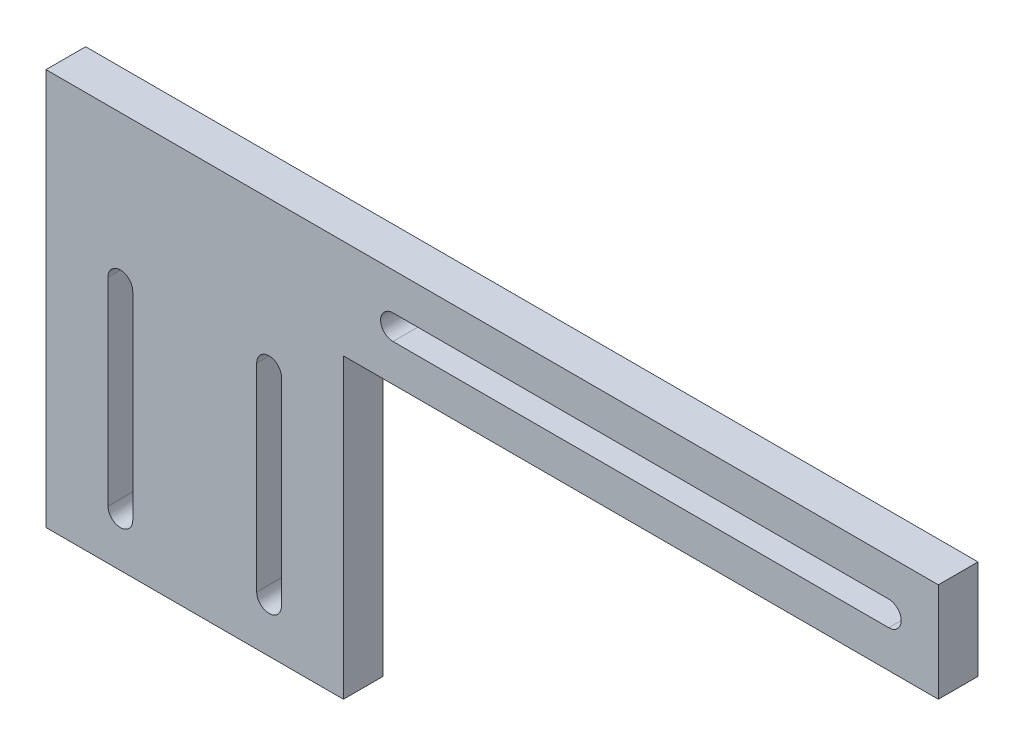
ISO-10303-21;
HEADER;
FILE_DESCRIPTION(('STEP AP214'),'2;1');
FILE_NAME('part.step','',(''),(''),'','','');
FILE_SCHEMA(('AUTOMOTIVE_DESIGN { 1 0 10303 214 1 1 1 1 }'));
ENDSEC;
DATA;
#1=APPLICATION_CONTEXT('core data for automotive mechanical design processes');
#2=APPLICATION_PROTOCOL_DEFINITION('international standard','automotive_design',2000,#1);
#3=PRODUCT_CONTEXT('',#1,'mechanical');
#4=PRODUCT('Part','Part','',(#3));
#5=PRODUCT_RELATED_PRODUCT_CATEGORY('part','',(#4));
#6=PRODUCT_DEFINITION_FORMATION('','',#4);
#7=PRODUCT_DEFINITION_CONTEXT('part definition',#1,'design');
#8=PRODUCT_DEFINITION('design','',#6,#7);
#9=PRODUCT_DEFINITION_SHAPE('','',#8);
#10=(LENGTH_UNIT() NAMED_UNIT(*) SI_UNIT(.MILLI.,.METRE.));
#11=(NAMED_UNIT(*) PLANE_ANGLE_UNIT() SI_UNIT($,.RADIAN.));
#12=(NAMED_UNIT(*) SI_UNIT($,.STERADIAN.) SOLID_ANGLE_UNIT());
#13=UNCERTAINTY_MEASURE_WITH_UNIT(LENGTH_MEASURE(1.E-05),#10,'distance_accuracy_value','');
#14=(GEOMETRIC_REPRESENTATION_CONTEXT(3) GLOBAL_UNCERTAINTY_ASSIGNED_CONTEXT((#13)) GLOBAL_UNIT_ASSIGNED_CONTEXT((#10,
#11,#12)) REPRESENTATION_CONTEXT('',''));
#15=CARTESIAN_POINT('',(0.,0.,0.));
#16=DIRECTION('',(0.,0.,1.));
#17=DIRECTION('',(1.,0.,0.));
#18=AXIS2_PLACEMENT_3D('',#15,#16,#17);
#19=CARTESIAN_POINT('',(0.,0.,5.08));
#20=DIRECTION('',(0.,0.,1.));
#21=DIRECTION('',(1.,0.,0.));
#22=AXIS2_PLACEMENT_3D('',#19,#20,#21);
#23=PLANE('',#22);
#24=DIRECTION('',(0.,-1.,0.));
#25=VECTOR('',#24,1.);
#26=CARTESIAN_POINT('',(0.,50.8,5.08));
#27=LINE('',#26,#25);
#28=CARTESIAN_POINT('',(0.,50.8,5.08));
#29=VERTEX_POINT('',#28);
#30=CARTESIAN_POINT('',(0.,0.,5.08));
#31=VERTEX_POINT('',#30);
#32=EDGE_CURVE('E258',#29,#31,#27,.T.);
#33=ORIENTED_EDGE('',*,*,#32,.T.);
#34=DIRECTION('',(1.,0.,0.));
#35=VECTOR('',#34,1.);
#36=CARTESIAN_POINT('',(0.,0.,5.08));
#37=LINE('',#36,#35);
#38=CARTESIAN_POINT('',(38.1,0.,5.08));
#39=VERTEX_POINT('',#38);
#40=EDGE_CURVE('E261',#31,#39,#37,.T.);
#41=ORIENTED_EDGE('',*,*,#40,.T.);
#42=DIRECTION('',(0.,1.,0.));
#43=VECTOR('',#42,1.);
#44=CARTESIAN_POINT('',(38.1,0.,5.08));
#45=LINE('',#44,#43);
#46=CARTESIAN_POINT('',(38.1,38.1,5.08));
#47=VERTEX_POINT('',#46);
#48=EDGE_CURVE('E264',#39,#47,#45,.T.);
#49=ORIENTED_EDGE('',*,*,#48,.T.);
#50=DIRECTION('',(1.,0.,0.));
#51=VECTOR('',#50,1.);
#52=CARTESIAN_POINT('',(38.1,38.1,5.08));
#53=LINE('',#52,#51);
#54=CARTESIAN_POINT('',(114.3,38.1,5.08));
#55=VERTEX_POINT('',#54);
#56=EDGE_CURVE('E266',#47,#55,#53,.T.);
#57=ORIENTED_EDGE('',*,*,#56,.T.);
#58=DIRECTION('',(0.,1.,0.));
#59=VECTOR('',#58,1.);
#60=CARTESIAN_POINT('',(114.3,38.1,5.08));
#61=LINE('',#60,#59);
#62=CARTESIAN_POINT('',(114.3,50.8,5.08));
#63=VERTEX_POINT('',#62);
#64=EDGE_CURVE('E268',#55,#63,#61,.T.);
#65=ORIENTED_EDGE('',*,*,#64,.T.);
#66=DIRECTION('',(-1.,0.,0.));
#67=VECTOR('',#66,1.);
#68=CARTESIAN_POINT('',(114.3,50.8,5.08));
#69=LINE('',#68,#67);
#70=EDGE_CURVE('E270',#63,#29,#69,.T.);
#71=ORIENTED_EDGE('',*,*,#70,.T.);
#72=EDGE_LOOP('',(#33,#41,#49,#57,#65,#71));
#73=FACE_BOUND('',#72,.T.);
#74=DIRECTION('',(0.,1.,0.));
#75=VECTOR('',#74,1.);
#76=CARTESIAN_POINT('',(11.1125,6.35,5.08));
#77=LINE('',#76,#75);
#78=CARTESIAN_POINT('',(11.1125,6.35,5.08));
#79=VERTEX_POINT('',#78);
#80=CARTESIAN_POINT('',(11.1125,31.75,5.08));
#81=VERTEX_POINT('',#80);
#82=EDGE_CURVE('E229',#79,#81,#77,.T.);
#83=ORIENTED_EDGE('',*,*,#82,.F.);
#84=CARTESIAN_POINT('',(9.525,6.35,5.08));
#85=DIRECTION('',(0.,0.,1.));
#86=DIRECTION('',(1.,0.,0.));
#87=AXIS2_PLACEMENT_3D('',#84,#85,#86);
#88=CIRCLE('',#87,1.5875);
#89=CARTESIAN_POINT('',(7.9375,6.35,5.08));
#90=VERTEX_POINT('',#89);
#91=EDGE_CURVE('E227',#90,#79,#88,.T.);
#92=ORIENTED_EDGE('',*,*,#91,.F.);
#93=DIRECTION('',(0.,-1.,0.));
#94=VECTOR('',#93,1.);
#95=CARTESIAN_POINT('',(7.9375,6.35,5.08));
#96=LINE('',#95,#94);
#97=CARTESIAN_POINT('',(7.9375,31.75,5.08));
#98=VERTEX_POINT('',#97);
#99=EDGE_CURVE('E235',#98,#90,#96,.T.);
#100=ORIENTED_EDGE('',*,*,#99,.F.);
#101=CARTESIAN_POINT('',(9.525,31.75,5.08));
#102=DIRECTION('',(0.,0.,1.));
#103=DIRECTION('',(1.,0.,0.));
#104=AXIS2_PLACEMENT_3D('',#101,#102,#103);
#105=CIRCLE('',#104,1.5875);
#106=EDGE_CURVE('E232',#81,#98,#105,.T.);
#107=ORIENTED_EDGE('',*,*,#106,.F.);
#108=EDGE_LOOP('',(#83,#92,#100,#107));
#109=FACE_BOUND('',#108,.T.);
#110=DIRECTION('',(0.,-1.,0.));
#111=VECTOR('',#110,1.);
#112=CARTESIAN_POINT('',(26.9875,31.75,5.08));
#113=LINE('',#112,#111);
#114=CARTESIAN_POINT('',(26.9875,31.75,5.08));
#115=VERTEX_POINT('',#114);
#116=CARTESIAN_POINT('',(26.9875,6.35,5.08));
#117=VERTEX_POINT('',#116);
#118=EDGE_CURVE('E198',#115,#117,#113,.T.);
#119=ORIENTED_EDGE('',*,*,#118,.F.);
#120=CARTESIAN_POINT('',(28.575,31.75,5.08));
#121=DIRECTION('',(0.,0.,1.));
#122=DIRECTION('',(1.,0.,0.));
#123=AXIS2_PLACEMENT_3D('',#120,#121,#122);
#124=CIRCLE('',#123,1.5875);
#125=CARTESIAN_POINT('',(30.1625,31.75,5.08));
#126=VERTEX_POINT('',#125);
#127=EDGE_CURVE('E196',#126,#115,#124,.T.);
#128=ORIENTED_EDGE('',*,*,#127,.F.);
#129=DIRECTION('',(0.,1.,0.));
#130=VECTOR('',#129,1.);
#131=CARTESIAN_POINT('',(30.1625,31.75,5.08));
#132=LINE('',#131,#130);
#133=CARTESIAN_POINT('',(30.1625,6.35,5.08));
#134=VERTEX_POINT('',#133);
#135=EDGE_CURVE('E204',#134,#126,#132,.T.);
#136=ORIENTED_EDGE('',*,*,#135,.F.);
#137=CARTESIAN_POINT('',(28.575,6.35,5.08));
#138=DIRECTION('',(0.,0.,1.));
#139=DIRECTION('',(1.,0.,0.));
#140=AXIS2_PLACEMENT_3D('',#137,#138,#139);
#141=CIRCLE('',#140,1.5875);
#142=EDGE_CURVE('E201',#117,#134,#141,.T.);
#143=ORIENTED_EDGE('',*,*,#142,.F.);
#144=EDGE_LOOP('',(#119,#128,#136,#143));
#145=FACE_BOUND('',#144,.T.);
#146=DIRECTION('',(-1.,0.,0.));
#147=VECTOR('',#146,1.);
#148=CARTESIAN_POINT('',(107.95,46.0375,5.08));
#149=LINE('',#148,#147);
#150=CARTESIAN_POINT('',(107.95,46.0375,5.08));
#151=VERTEX_POINT('',#150);
#152=CARTESIAN_POINT('',(44.45,46.0375,5.08));
#153=VERTEX_POINT('',#152);
#154=EDGE_CURVE('E168',#151,#153,#149,.T.);
#155=ORIENTED_EDGE('',*,*,#154,.F.);
#156=CARTESIAN_POINT('',(107.95,44.45,5.08));
#157=DIRECTION('',(0.,0.,1.));
#158=DIRECTION('',(1.,0.,0.));
#159=AXIS2_PLACEMENT_3D('',#156,#157,#158);
#160=CIRCLE('',#159,1.58750000000001);
#161=CARTESIAN_POINT('',(107.95,42.8625,5.08));
#162=VERTEX_POINT('',#161);
#163=EDGE_CURVE('E160',#162,#151,#160,.T.);
#164=ORIENTED_EDGE('',*,*,#163,.F.);
#165=DIRECTION('',(1.,0.,0.));
#166=VECTOR('',#165,1.);
#167=CARTESIAN_POINT('',(107.95,42.8625,5.08));
#168=LINE('',#167,#166);
#169=CARTESIAN_POINT('',(44.45,42.8625,5.08));
#170=VERTEX_POINT('',#169);
#171=EDGE_CURVE('E182',#170,#162,#168,.T.);
#172=ORIENTED_EDGE('',*,*,#171,.F.);
#173=CARTESIAN_POINT('',(44.45,44.45,5.08));
#174=DIRECTION('',(0.,0.,1.));
#175=DIRECTION('',(1.,0.,0.));
#176=AXIS2_PLACEMENT_3D('',#173,#174,#175);
#177=CIRCLE('',#176,1.58750000000001);
#178=EDGE_CURVE('E180',#153,#170,#177,.T.);
#179=ORIENTED_EDGE('',*,*,#178,.F.);
#180=EDGE_LOOP('',(#155,#164,#172,#179));
#181=FACE_BOUND('',#180,.T.);
#182=ADVANCED_FACE('F35',(#73,#109,#145,#181),#23,.T.);
#183=CARTESIAN_POINT('',(0.,0.,0.));
#184=DIRECTION('',(0.,0.,1.));
#185=DIRECTION('',(1.,0.,0.));
#186=AXIS2_PLACEMENT_3D('',#183,#184,#185);
#187=PLANE('',#186);
#188=CARTESIAN_POINT('',(28.575,31.75,0.));
#189=DIRECTION('',(0.,0.,1.));
#190=DIRECTION('',(1.,0.,0.));
#191=AXIS2_PLACEMENT_3D('',#188,#189,#190);
#192=CIRCLE('',#191,1.5875);
#193=CARTESIAN_POINT('',(30.1625,31.75,0.));
#194=VERTEX_POINT('',#193);
#195=CARTESIAN_POINT('',(26.9875,31.75,0.));
#196=VERTEX_POINT('',#195);
#197=EDGE_CURVE('E176',#194,#196,#192,.T.);
#198=ORIENTED_EDGE('',*,*,#197,.T.);
#199=DIRECTION('',(0.,-1.,0.));
#200=VECTOR('',#199,1.);
#201=CARTESIAN_POINT('',(26.9875,31.75,0.));
#202=LINE('',#201,#200);
#203=CARTESIAN_POINT('',(26.9875,6.35,0.));
#204=VERTEX_POINT('',#203);
#205=EDGE_CURVE('E209',#196,#204,#202,.T.);
#206=ORIENTED_EDGE('',*,*,#205,.T.);
#207=CARTESIAN_POINT('',(28.575,6.35,0.));
#208=DIRECTION('',(0.,0.,1.));
#209=DIRECTION('',(1.,0.,0.));
#210=AXIS2_PLACEMENT_3D('',#207,#208,#209);
#211=CIRCLE('',#210,1.5875);
#212=CARTESIAN_POINT('',(30.1625,6.35,0.));
#213=VERTEX_POINT('',#212);
#214=EDGE_CURVE('E212',#204,#213,#211,.T.);
#215=ORIENTED_EDGE('',*,*,#214,.T.);
#216=DIRECTION('',(0.,1.,0.));
#217=VECTOR('',#216,1.);
#218=CARTESIAN_POINT('',(30.1625,31.75,0.));
#219=LINE('',#218,#217);
#220=EDGE_CURVE('E199',#213,#194,#219,.T.);
#221=ORIENTED_EDGE('',*,*,#220,.T.);
#222=EDGE_LOOP('',(#198,#206,#215,#221));
#223=FACE_BOUND('',#222,.T.);
#224=DIRECTION('',(0.,-1.,0.));
#225=VECTOR('',#224,1.);
#226=CARTESIAN_POINT('',(0.,50.8,0.));
#227=LINE('',#226,#225);
#228=CARTESIAN_POINT('',(0.,50.8,0.));
#229=VERTEX_POINT('',#228);
#230=CARTESIAN_POINT('',(0.,0.,0.));
#231=VERTEX_POINT('',#230);
#232=EDGE_CURVE('E257',#229,#231,#227,.T.);
#233=ORIENTED_EDGE('',*,*,#232,.F.);
#234=DIRECTION('',(-1.,0.,0.));
#235=VECTOR('',#234,1.);
#236=CARTESIAN_POINT('',(114.3,50.8,0.));
#237=LINE('',#236,#235);
#238=CARTESIAN_POINT('',(114.3,50.8,0.));
#239=VERTEX_POINT('',#238);
#240=EDGE_CURVE('E262',#239,#229,#237,.T.);
#241=ORIENTED_EDGE('',*,*,#240,.F.);
#242=DIRECTION('',(0.,1.,0.));
#243=VECTOR('',#242,1.);
#244=CARTESIAN_POINT('',(114.3,38.1,0.));
#245=LINE('',#244,#243);
#246=CARTESIAN_POINT('',(114.3,38.1,0.));
#247=VERTEX_POINT('',#246);
#248=EDGE_CURVE('E281',#247,#239,#245,.T.);
#249=ORIENTED_EDGE('',*,*,#248,.F.);
#250=DIRECTION('',(1.,0.,0.));
#251=VECTOR('',#250,1.);
#252=CARTESIAN_POINT('',(38.1,38.1,0.));
#253=LINE('',#252,#251);
#254=CARTESIAN_POINT('',(38.1,38.1,0.));
#255=VERTEX_POINT('',#254);
#256=EDGE_CURVE('E279',#255,#247,#253,.T.);
#257=ORIENTED_EDGE('',*,*,#256,.F.);
#258=DIRECTION('',(0.,1.,0.));
#259=VECTOR('',#258,1.);
#260=CARTESIAN_POINT('',(38.1,0.,0.));
#261=LINE('',#260,#259);
#262=CARTESIAN_POINT('',(38.1,0.,0.));
#263=VERTEX_POINT('',#262);
#264=EDGE_CURVE('E277',#263,#255,#261,.T.);
#265=ORIENTED_EDGE('',*,*,#264,.F.);
#266=DIRECTION('',(1.,0.,0.));
#267=VECTOR('',#266,1.);
#268=CARTESIAN_POINT('',(0.,0.,0.));
#269=LINE('',#268,#267);
#270=EDGE_CURVE('E275',#231,#263,#269,.T.);
#271=ORIENTED_EDGE('',*,*,#270,.F.);
#272=EDGE_LOOP('',(#233,#241,#249,#257,#265,#271));
#273=FACE_BOUND('',#272,.T.);
#274=CARTESIAN_POINT('',(9.525,6.35,0.));
#275=DIRECTION('',(0.,0.,1.));
#276=DIRECTION('',(1.,0.,0.));
#277=AXIS2_PLACEMENT_3D('',#274,#275,#276);
#278=CIRCLE('',#277,1.5875);
#279=CARTESIAN_POINT('',(7.9375,6.35,0.));
#280=VERTEX_POINT('',#279);
#281=CARTESIAN_POINT('',(11.1125,6.35,0.));
#282=VERTEX_POINT('',#281);
#283=EDGE_CURVE('E226',#280,#282,#278,.T.);
#284=ORIENTED_EDGE('',*,*,#283,.T.);
#285=DIRECTION('',(0.,1.,0.));
#286=VECTOR('',#285,1.);
#287=CARTESIAN_POINT('',(11.1125,6.35,0.));
#288=LINE('',#287,#286);
#289=CARTESIAN_POINT('',(11.1125,31.75,0.));
#290=VERTEX_POINT('',#289);
#291=EDGE_CURVE('E240',#282,#290,#288,.T.);
#292=ORIENTED_EDGE('',*,*,#291,.T.);
#293=CARTESIAN_POINT('',(9.525,31.75,0.));
#294=DIRECTION('',(0.,0.,1.));
#295=DIRECTION('',(1.,0.,0.));
#296=AXIS2_PLACEMENT_3D('',#293,#294,#295);
#297=CIRCLE('',#296,1.5875);
#298=CARTESIAN_POINT('',(7.9375,31.75,0.));
#299=VERTEX_POINT('',#298);
#300=EDGE_CURVE('E243',#290,#299,#297,.T.);
#301=ORIENTED_EDGE('',*,*,#300,.T.);
#302=DIRECTION('',(0.,-1.,0.));
#303=VECTOR('',#302,1.);
#304=CARTESIAN_POINT('',(7.9375,6.35,0.));
#305=LINE('',#304,#303);
#306=EDGE_CURVE('E230',#299,#280,#305,.T.);
#307=ORIENTED_EDGE('',*,*,#306,.T.);
#308=EDGE_LOOP('',(#284,#292,#301,#307));
#309=FACE_BOUND('',#308,.T.);
#310=CARTESIAN_POINT('',(107.95,44.45,0.));
#311=DIRECTION('',(0.,0.,1.));
#312=DIRECTION('',(1.,0.,0.));
#313=AXIS2_PLACEMENT_3D('',#310,#311,#312);
#314=CIRCLE('',#313,1.58750000000001);
#315=CARTESIAN_POINT('',(107.95,42.8625,0.));
#316=VERTEX_POINT('',#315);
#317=CARTESIAN_POINT('',(107.95,46.0375,0.));
#318=VERTEX_POINT('',#317);
#319=EDGE_CURVE('E58',#316,#318,#314,.T.);
#320=ORIENTED_EDGE('',*,*,#319,.T.);
#321=DIRECTION('',(-1.,0.,0.));
#322=VECTOR('',#321,1.);
#323=CARTESIAN_POINT('',(107.95,46.0375,0.));
#324=LINE('',#323,#322);
#325=CARTESIAN_POINT('',(44.45,46.0375,0.));
#326=VERTEX_POINT('',#325);
#327=EDGE_CURVE('E175',#318,#326,#324,.T.);
#328=ORIENTED_EDGE('',*,*,#327,.T.);
#329=CARTESIAN_POINT('',(44.45,44.45,0.));
#330=DIRECTION('',(0.,0.,1.));
#331=DIRECTION('',(1.,0.,0.));
#332=AXIS2_PLACEMENT_3D('',#329,#330,#331);
#333=CIRCLE('',#332,1.58750000000001);
#334=CARTESIAN_POINT('',(44.45,42.8625,0.));
#335=VERTEX_POINT('',#334);
#336=EDGE_CURVE('E188',#326,#335,#333,.T.);
#337=ORIENTED_EDGE('',*,*,#336,.T.);
#338=DIRECTION('',(1.,0.,0.));
#339=VECTOR('',#338,1.);
#340=CARTESIAN_POINT('',(107.95,42.8625,0.));
#341=LINE('',#340,#339);
#342=EDGE_CURVE('E169',#335,#316,#341,.T.);
#343=ORIENTED_EDGE('',*,*,#342,.T.);
#344=EDGE_LOOP('',(#320,#328,#337,#343));
#345=FACE_BOUND('',#344,.T.);
#346=ADVANCED_FACE('F305',(#223,#273,#309,#345),#187,.F.);
#347=CARTESIAN_POINT('',(0.,50.8,5.08));
#348=DIRECTION('',(1.,0.,0.));
#349=DIRECTION('',(0.,1.,0.));
#350=AXIS2_PLACEMENT_3D('',#347,#348,#349);
#351=PLANE('',#350);
#352=ORIENTED_EDGE('',*,*,#232,.T.);
#353=DIRECTION('',(0.,0.,-1.));
#354=VECTOR('',#353,1.);
#355=CARTESIAN_POINT('',(0.,0.,5.08));
#356=LINE('',#355,#354);
#357=EDGE_CURVE('E11',#31,#231,#356,.T.);
#358=ORIENTED_EDGE('',*,*,#357,.F.);
#359=ORIENTED_EDGE('',*,*,#32,.F.);
#360=DIRECTION('',(0.,0.,-1.));
#361=VECTOR('',#360,1.);
#362=CARTESIAN_POINT('',(0.,50.8,5.08));
#363=LINE('',#362,#361);
#364=EDGE_CURVE('E272',#29,#229,#363,.T.);
#365=ORIENTED_EDGE('',*,*,#364,.T.);
#366=EDGE_LOOP('',(#352,#358,#359,#365));
#367=FACE_BOUND('',#366,.T.);
#368=ADVANCED_FACE('F37',(#367),#351,.F.);
#369=CARTESIAN_POINT('',(0.,0.,5.08));
#370=DIRECTION('',(0.,1.,0.));
#371=DIRECTION('',(0.,0.,1.));
#372=AXIS2_PLACEMENT_3D('',#369,#370,#371);
#373=PLANE('',#372);
#374=ORIENTED_EDGE('',*,*,#270,.T.);
#375=DIRECTION('',(0.,0.,-1.));
#376=VECTOR('',#375,1.);
#377=CARTESIAN_POINT('',(38.1,0.,5.08));
#378=LINE('',#377,#376);
#379=EDGE_CURVE('E43',#39,#263,#378,.T.);
#380=ORIENTED_EDGE('',*,*,#379,.F.);
#381=ORIENTED_EDGE('',*,*,#40,.F.);
#382=ORIENTED_EDGE('',*,*,#357,.T.);
#383=EDGE_LOOP('',(#374,#380,#381,#382));
#384=FACE_BOUND('',#383,.T.);
#385=ADVANCED_FACE('F323',(#384),#373,.F.);
#386=CARTESIAN_POINT('',(38.1,0.,5.08));
#387=DIRECTION('',(-1.,0.,0.));
#388=DIRECTION('',(0.,0.,1.));
#389=AXIS2_PLACEMENT_3D('',#386,#387,#388);
#390=PLANE('',#389);
#391=ORIENTED_EDGE('',*,*,#264,.T.);
#392=DIRECTION('',(0.,0.,-1.));
#393=VECTOR('',#392,1.);
#394=CARTESIAN_POINT('',(38.1,38.1,5.08));
#395=LINE('',#394,#393);
#396=EDGE_CURVE('E292',#47,#255,#395,.T.);
#397=ORIENTED_EDGE('',*,*,#396,.F.);
#398=ORIENTED_EDGE('',*,*,#48,.F.);
#399=ORIENTED_EDGE('',*,*,#379,.T.);
#400=EDGE_LOOP('',(#391,#397,#398,#399));
#401=FACE_BOUND('',#400,.T.);
#402=ADVANCED_FACE('F299',(#401),#390,.F.);
#403=CARTESIAN_POINT('',(38.1,38.1,5.08));
#404=DIRECTION('',(0.,1.,0.));
#405=DIRECTION('',(0.,0.,1.));
#406=AXIS2_PLACEMENT_3D('',#403,#404,#405);
#407=PLANE('',#406);
#408=ORIENTED_EDGE('',*,*,#256,.T.);
#409=DIRECTION('',(0.,0.,-1.));
#410=VECTOR('',#409,1.);
#411=CARTESIAN_POINT('',(114.3,38.1,5.08));
#412=LINE('',#411,#410);
#413=EDGE_CURVE('E289',#55,#247,#412,.T.);
#414=ORIENTED_EDGE('',*,*,#413,.F.);
#415=ORIENTED_EDGE('',*,*,#56,.F.);
#416=ORIENTED_EDGE('',*,*,#396,.T.);
#417=EDGE_LOOP('',(#408,#414,#415,#416));
#418=FACE_BOUND('',#417,.T.);
#419=ADVANCED_FACE('F311',(#418),#407,.F.);
#420=CARTESIAN_POINT('',(114.3,38.1,5.08));
#421=DIRECTION('',(-1.,0.,0.));
#422=DIRECTION('',(0.,-1.,0.));
#423=AXIS2_PLACEMENT_3D('',#420,#421,#422);
#424=PLANE('',#423);
#425=ORIENTED_EDGE('',*,*,#248,.T.);
#426=DIRECTION('',(0.,0.,-1.));
#427=VECTOR('',#426,1.);
#428=CARTESIAN_POINT('',(114.3,50.8,5.08));
#429=LINE('',#428,#427);
#430=EDGE_CURVE('E286',#63,#239,#429,.T.);
#431=ORIENTED_EDGE('',*,*,#430,.F.);
#432=ORIENTED_EDGE('',*,*,#64,.F.);
#433=ORIENTED_EDGE('',*,*,#413,.T.);
#434=EDGE_LOOP('',(#425,#431,#432,#433));
#435=FACE_BOUND('',#434,.T.);
#436=ADVANCED_FACE('F315',(#435),#424,.F.);
#437=CARTESIAN_POINT('',(114.3,50.8,5.08));
#438=DIRECTION('',(0.,-1.,0.));
#439=DIRECTION('',(1.,0.,0.));
#440=AXIS2_PLACEMENT_3D('',#437,#438,#439);
#441=PLANE('',#440);
#442=ORIENTED_EDGE('',*,*,#240,.T.);
#443=ORIENTED_EDGE('',*,*,#364,.F.);
#444=ORIENTED_EDGE('',*,*,#70,.F.);
#445=ORIENTED_EDGE('',*,*,#430,.T.);
#446=EDGE_LOOP('',(#442,#443,#444,#445));
#447=FACE_BOUND('',#446,.T.);
#448=ADVANCED_FACE('F326',(#447),#441,.F.);
#449=CARTESIAN_POINT('',(9.525,6.35,5.08));
#450=DIRECTION('',(0.,0.,-1.));
#451=DIRECTION('',(-1.,0.,0.));
#452=AXIS2_PLACEMENT_3D('',#449,#450,#451);
#453=CYLINDRICAL_SURFACE('',#452,1.5875);
#454=ORIENTED_EDGE('',*,*,#283,.F.);
#455=DIRECTION('',(0.,0.,-1.));
#456=VECTOR('',#455,1.);
#457=CARTESIAN_POINT('',(7.9375,6.35,5.08));
#458=LINE('',#457,#456);
#459=EDGE_CURVE('E237',#90,#280,#458,.T.);
#460=ORIENTED_EDGE('',*,*,#459,.F.);
#461=ORIENTED_EDGE('',*,*,#91,.T.);
#462=DIRECTION('',(0.,0.,-1.));
#463=VECTOR('',#462,1.);
#464=CARTESIAN_POINT('',(11.1125,6.35,5.08));
#465=LINE('',#464,#463);
#466=EDGE_CURVE('E254',#79,#282,#465,.T.);
#467=ORIENTED_EDGE('',*,*,#466,.T.);
#468=EDGE_LOOP('',(#454,#460,#461,#467));
#469=FACE_BOUND('',#468,.T.);
#470=ADVANCED_FACE('F328',(#469),#453,.F.);
#471=CARTESIAN_POINT('',(11.1125,6.35,5.08));
#472=DIRECTION('',(-1.,0.,0.));
#473=DIRECTION('',(0.,-1.,0.));
#474=AXIS2_PLACEMENT_3D('',#471,#472,#473);
#475=PLANE('',#474);
#476=ORIENTED_EDGE('',*,*,#291,.F.);
#477=ORIENTED_EDGE('',*,*,#466,.F.);
#478=ORIENTED_EDGE('',*,*,#82,.T.);
#479=DIRECTION('',(0.,0.,-1.));
#480=VECTOR('',#479,1.);
#481=CARTESIAN_POINT('',(11.1125,31.75,5.08));
#482=LINE('',#481,#480);
#483=EDGE_CURVE('E252',#81,#290,#482,.T.);
#484=ORIENTED_EDGE('',*,*,#483,.T.);
#485=EDGE_LOOP('',(#476,#477,#478,#484));
#486=FACE_BOUND('',#485,.T.);
#487=ADVANCED_FACE('F334',(#486),#475,.T.);
#488=CARTESIAN_POINT('',(9.525,31.75,5.08));
#489=DIRECTION('',(0.,0.,-1.));
#490=DIRECTION('',(-1.,0.,0.));
#491=AXIS2_PLACEMENT_3D('',#488,#489,#490);
#492=CYLINDRICAL_SURFACE('',#491,1.5875);
#493=ORIENTED_EDGE('',*,*,#300,.F.);
#494=ORIENTED_EDGE('',*,*,#483,.F.);
#495=ORIENTED_EDGE('',*,*,#106,.T.);
#496=DIRECTION('',(0.,0.,-1.));
#497=VECTOR('',#496,1.);
#498=CARTESIAN_POINT('',(7.9375,31.75,5.08));
#499=LINE('',#498,#497);
#500=EDGE_CURVE('E250',#98,#299,#499,.T.);
#501=ORIENTED_EDGE('',*,*,#500,.T.);
#502=EDGE_LOOP('',(#493,#494,#495,#501));
#503=FACE_BOUND('',#502,.T.);
#504=ADVANCED_FACE('F348',(#503),#492,.F.);
#505=CARTESIAN_POINT('',(7.9375,6.35,5.08));
#506=DIRECTION('',(1.,0.,0.));
#507=DIRECTION('',(0.,1.,0.));
#508=AXIS2_PLACEMENT_3D('',#505,#506,#507);
#509=PLANE('',#508);
#510=ORIENTED_EDGE('',*,*,#306,.F.);
#511=ORIENTED_EDGE('',*,*,#500,.F.);
#512=ORIENTED_EDGE('',*,*,#99,.T.);
#513=ORIENTED_EDGE('',*,*,#459,.T.);
#514=EDGE_LOOP('',(#510,#511,#512,#513));
#515=FACE_BOUND('',#514,.T.);
#516=ADVANCED_FACE('F352',(#515),#509,.T.);
#517=CARTESIAN_POINT('',(28.575,31.75,5.08));
#518=DIRECTION('',(0.,0.,-1.));
#519=DIRECTION('',(-1.,0.,0.));
#520=AXIS2_PLACEMENT_3D('',#517,#518,#519);
#521=CYLINDRICAL_SURFACE('',#520,1.5875);
#522=ORIENTED_EDGE('',*,*,#197,.F.);
#523=DIRECTION('',(0.,0.,-1.));
#524=VECTOR('',#523,1.);
#525=CARTESIAN_POINT('',(30.1625,31.75,5.08));
#526=LINE('',#525,#524);
#527=EDGE_CURVE('E206',#126,#194,#526,.T.);
#528=ORIENTED_EDGE('',*,*,#527,.F.);
#529=ORIENTED_EDGE('',*,*,#127,.T.);
#530=DIRECTION('',(0.,0.,-1.));
#531=VECTOR('',#530,1.);
#532=CARTESIAN_POINT('',(26.9875,31.75,5.08));
#533=LINE('',#532,#531);
#534=EDGE_CURVE('E223',#115,#196,#533,.T.);
#535=ORIENTED_EDGE('',*,*,#534,.T.);
#536=EDGE_LOOP('',(#522,#528,#529,#535));
#537=FACE_BOUND('',#536,.T.);
#538=ADVANCED_FACE('F356',(#537),#521,.F.);
#539=CARTESIAN_POINT('',(26.9875,31.75,5.08));
#540=DIRECTION('',(1.,0.,0.));
#541=DIRECTION('',(0.,1.,0.));
#542=AXIS2_PLACEMENT_3D('',#539,#540,#541);
#543=PLANE('',#542);
#544=ORIENTED_EDGE('',*,*,#205,.F.);
#545=ORIENTED_EDGE('',*,*,#534,.F.);
#546=ORIENTED_EDGE('',*,*,#118,.T.);
#547=DIRECTION('',(0.,0.,-1.));
#548=VECTOR('',#547,1.);
#549=CARTESIAN_POINT('',(26.9875,6.35,5.08));
#550=LINE('',#549,#548);
#551=EDGE_CURVE('E221',#117,#204,#550,.T.);
#552=ORIENTED_EDGE('',*,*,#551,.T.);
#553=EDGE_LOOP('',(#544,#545,#546,#552));
#554=FACE_BOUND('',#553,.T.);
#555=ADVANCED_FACE('F360',(#554),#543,.T.);
#556=CARTESIAN_POINT('',(28.575,6.35,5.08));
#557=DIRECTION('',(0.,0.,-1.));
#558=DIRECTION('',(-1.,0.,0.));
#559=AXIS2_PLACEMENT_3D('',#556,#557,#558);
#560=CYLINDRICAL_SURFACE('',#559,1.5875);
#561=ORIENTED_EDGE('',*,*,#214,.F.);
#562=ORIENTED_EDGE('',*,*,#551,.F.);
#563=ORIENTED_EDGE('',*,*,#142,.T.);
#564=DIRECTION('',(0.,0.,-1.));
#565=VECTOR('',#564,1.);
#566=CARTESIAN_POINT('',(30.1625,6.35,5.08));
#567=LINE('',#566,#565);
#568=EDGE_CURVE('E219',#134,#213,#567,.T.);
#569=ORIENTED_EDGE('',*,*,#568,.T.);
#570=EDGE_LOOP('',(#561,#562,#563,#569));
#571=FACE_BOUND('',#570,.T.);
#572=ADVANCED_FACE('F364',(#571),#560,.F.);
#573=CARTESIAN_POINT('',(30.1625,31.75,5.08));
#574=DIRECTION('',(-1.,0.,0.));
#575=DIRECTION('',(0.,-1.,0.));
#576=AXIS2_PLACEMENT_3D('',#573,#574,#575);
#577=PLANE('',#576);
#578=ORIENTED_EDGE('',*,*,#220,.F.);
#579=ORIENTED_EDGE('',*,*,#568,.F.);
#580=ORIENTED_EDGE('',*,*,#135,.T.);
#581=ORIENTED_EDGE('',*,*,#527,.T.);
#582=EDGE_LOOP('',(#578,#579,#580,#581));
#583=FACE_BOUND('',#582,.T.);
#584=ADVANCED_FACE('F368',(#583),#577,.T.);
#585=CARTESIAN_POINT('',(107.95,44.45,5.08));
#586=DIRECTION('',(0.,0.,-1.));
#587=DIRECTION('',(-1.,0.,0.));
#588=AXIS2_PLACEMENT_3D('',#585,#586,#587);
#589=CYLINDRICAL_SURFACE('',#588,1.58750000000001);
#590=ORIENTED_EDGE('',*,*,#319,.F.);
#591=DIRECTION('',(0.,0.,-1.));
#592=VECTOR('',#591,1.);
#593=CARTESIAN_POINT('',(107.95,42.8625,5.08));
#594=LINE('',#593,#592);
#595=EDGE_CURVE('E164',#162,#316,#594,.T.);
#596=ORIENTED_EDGE('',*,*,#595,.F.);
#597=ORIENTED_EDGE('',*,*,#163,.T.);
#598=DIRECTION('',(0.,0.,-1.));
#599=VECTOR('',#598,1.);
#600=CARTESIAN_POINT('',(107.95,46.0375,5.08));
#601=LINE('',#600,#599);
#602=EDGE_CURVE('E163',#151,#318,#601,.T.);
#603=ORIENTED_EDGE('',*,*,#602,.T.);
#604=EDGE_LOOP('',(#590,#596,#597,#603));
#605=FACE_BOUND('',#604,.T.);
#606=ADVANCED_FACE('F162',(#605),#589,.F.);
#607=CARTESIAN_POINT('',(107.95,46.0375,5.08));
#608=DIRECTION('',(0.,-1.,0.));
#609=DIRECTION('',(0.,0.,-1.));
#610=AXIS2_PLACEMENT_3D('',#607,#608,#609);
#611=PLANE('',#610);
#612=ORIENTED_EDGE('',*,*,#327,.F.);
#613=ORIENTED_EDGE('',*,*,#602,.F.);
#614=ORIENTED_EDGE('',*,*,#154,.T.);
#615=DIRECTION('',(0.,0.,-1.));
#616=VECTOR('',#615,1.);
#617=CARTESIAN_POINT('',(44.45,46.0375,5.08));
#618=LINE('',#617,#616);
#619=EDGE_CURVE('E177',#153,#326,#618,.T.);
#620=ORIENTED_EDGE('',*,*,#619,.T.);
#621=EDGE_LOOP('',(#612,#613,#614,#620));
#622=FACE_BOUND('',#621,.T.);
#623=ADVANCED_FACE('F172',(#622),#611,.T.);
#624=CARTESIAN_POINT('',(44.45,44.45,5.08));
#625=DIRECTION('',(0.,0.,-1.));
#626=DIRECTION('',(-1.,0.,0.));
#627=AXIS2_PLACEMENT_3D('',#624,#625,#626);
#628=CYLINDRICAL_SURFACE('',#627,1.58750000000001);
#629=ORIENTED_EDGE('',*,*,#336,.F.);
#630=ORIENTED_EDGE('',*,*,#619,.F.);
#631=ORIENTED_EDGE('',*,*,#178,.T.);
#632=DIRECTION('',(0.,0.,-1.));
#633=VECTOR('',#632,1.);
#634=CARTESIAN_POINT('',(44.45,42.8625,5.08));
#635=LINE('',#634,#633);
#636=EDGE_CURVE('E50',#170,#335,#635,.T.);
#637=ORIENTED_EDGE('',*,*,#636,.T.);
#638=EDGE_LOOP('',(#629,#630,#631,#637));
#639=FACE_BOUND('',#638,.T.);
#640=ADVANCED_FACE('F377',(#639),#628,.F.);
#641=CARTESIAN_POINT('',(107.95,42.8625,5.08));
#642=DIRECTION('',(0.,1.,0.));
#643=DIRECTION('',(0.,0.,1.));
#644=AXIS2_PLACEMENT_3D('',#641,#642,#643);
#645=PLANE('',#644);
#646=ORIENTED_EDGE('',*,*,#342,.F.);
#647=ORIENTED_EDGE('',*,*,#636,.F.);
#648=ORIENTED_EDGE('',*,*,#171,.T.);
#649=ORIENTED_EDGE('',*,*,#595,.T.);
#650=EDGE_LOOP('',(#646,#647,#648,#649));
#651=FACE_BOUND('',#650,.T.);
#652=ADVANCED_FACE('F380',(#651),#645,.T.);
#653=CLOSED_SHELL('',(#182,#346,#368,#385,#402,#419,#436,#448,#470,#487,#504,#516,#538,#555,
#572,#584,#606,#623,#640,#652));
#654=MANIFOLD_SOLID_BREP('B2',#653);
#655=ADVANCED_BREP_SHAPE_REPRESENTATION('',(#18,#654),#14);
#656=SHAPE_DEFINITION_REPRESENTATION(#9,#655);
ENDSEC;
END-ISO-10303-21;
